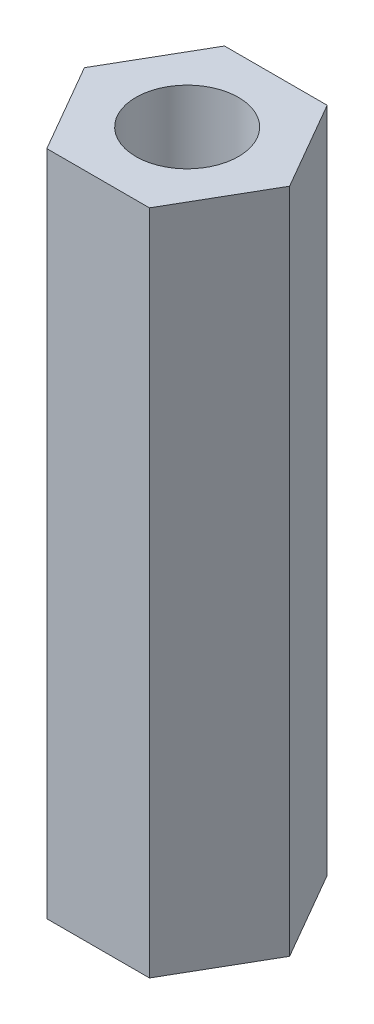
ISO-10303-21;
HEADER;
FILE_DESCRIPTION(('STEP AP214'),'2;1');
FILE_NAME('part.step','',(''),(''),'','','');
FILE_SCHEMA(('AUTOMOTIVE_DESIGN { 1 0 10303 214 1 1 1 1 }'));
ENDSEC;
DATA;
#1=APPLICATION_CONTEXT('core data for automotive mechanical design processes');
#2=APPLICATION_PROTOCOL_DEFINITION('international standard','automotive_design',2000,#1);
#3=PRODUCT_CONTEXT('',#1,'mechanical');
#4=PRODUCT('Part','Part','',(#3));
#5=PRODUCT_RELATED_PRODUCT_CATEGORY('part','',(#4));
#6=PRODUCT_DEFINITION_FORMATION('','',#4);
#7=PRODUCT_DEFINITION_CONTEXT('part definition',#1,'design');
#8=PRODUCT_DEFINITION('design','',#6,#7);
#9=PRODUCT_DEFINITION_SHAPE('','',#8);
#10=(LENGTH_UNIT() NAMED_UNIT(*) SI_UNIT(.MILLI.,.METRE.));
#11=(NAMED_UNIT(*) PLANE_ANGLE_UNIT() SI_UNIT($,.RADIAN.));
#12=(NAMED_UNIT(*) SI_UNIT($,.STERADIAN.) SOLID_ANGLE_UNIT());
#13=UNCERTAINTY_MEASURE_WITH_UNIT(LENGTH_MEASURE(1.E-05),#10,'distance_accuracy_value','');
#14=(GEOMETRIC_REPRESENTATION_CONTEXT(3) GLOBAL_UNCERTAINTY_ASSIGNED_CONTEXT((#13)) GLOBAL_UNIT_ASSIGNED_CONTEXT((#10,
#11,#12)) REPRESENTATION_CONTEXT('',''));
#15=CARTESIAN_POINT('',(0.,0.,0.));
#16=DIRECTION('',(0.,0.,1.));
#17=DIRECTION('',(1.,0.,0.));
#18=AXIS2_PLACEMENT_3D('',#15,#16,#17);
#19=CARTESIAN_POINT('',(0.,-15.,0.));
#20=DIRECTION('',(0.,1.,0.));
#21=DIRECTION('',(0.,0.,1.));
#22=AXIS2_PLACEMENT_3D('',#19,#20,#21);
#23=CYLINDRICAL_SURFACE('',#22,2.);
#24=CARTESIAN_POINT('',(0.,11.,0.));
#25=DIRECTION('',(0.,1.,0.));
#26=DIRECTION('',(0.,0.,1.));
#27=AXIS2_PLACEMENT_3D('',#24,#25,#26);
#28=CIRCLE('',#27,2.);
#29=CARTESIAN_POINT('',(0.,11.,2.));
#30=VERTEX_POINT('',#29);
#31=EDGE_CURVE('E197',#30,#30,#28,.T.);
#32=ORIENTED_EDGE('',*,*,#31,.T.);
#33=EDGE_LOOP('',(#32));
#34=FACE_BOUND('',#33,.T.);
#35=CARTESIAN_POINT('',(0.,-15.,0.));
#36=DIRECTION('',(0.,1.,0.));
#37=DIRECTION('',(0.,0.,1.));
#38=AXIS2_PLACEMENT_3D('',#35,#36,#37);
#39=CIRCLE('',#38,2.);
#40=CARTESIAN_POINT('',(2.,-15.,0.));
#41=VERTEX_POINT('',#40);
#42=CARTESIAN_POINT('',(-2.,-15.,0.));
#43=VERTEX_POINT('',#42);
#44=EDGE_CURVE('E50',#41,#43,#39,.F.);
#45=ORIENTED_EDGE('',*,*,#44,.T.);
#46=CARTESIAN_POINT('',(0.,-15.,0.));
#47=DIRECTION('',(0.,1.,0.));
#48=DIRECTION('',(0.,0.,1.));
#49=AXIS2_PLACEMENT_3D('',#46,#47,#48);
#50=CIRCLE('',#49,2.);
#51=EDGE_CURVE('E151',#43,#41,#50,.F.);
#52=ORIENTED_EDGE('',*,*,#51,.T.);
#53=EDGE_LOOP('',(#45,#52));
#54=FACE_BOUND('',#53,.T.);
#55=ADVANCED_FACE('F46',(#34,#54),#23,.F.);
#56=CARTESIAN_POINT('',(1.995272947503,-15.,3.466144344561));
#57=DIRECTION('',(0.866025403784429,0.,0.500000000000017));
#58=DIRECTION('',(0.500000000000017,0.,-0.866025403784429));
#59=AXIS2_PLACEMENT_3D('',#56,#57,#58);
#60=PLANE('',#59);
#61=DIRECTION('',(0.500000000000017,0.,-0.866025403784429));
#62=VECTOR('',#61,1.);
#63=CARTESIAN_POINT('',(3.99527294750324,11.,0.00204272942298056));
#64=LINE('',#63,#62);
#65=CARTESIAN_POINT('',(1.995272947503,11.,3.466144344561));
#66=VERTEX_POINT('',#65);
#67=CARTESIAN_POINT('',(3.99527294750324,11.,0.00204272942298056));
#68=VERTEX_POINT('',#67);
#69=EDGE_CURVE('E107',#66,#68,#64,.T.);
#70=ORIENTED_EDGE('',*,*,#69,.F.);
#71=DIRECTION('',(0.,1.,0.));
#72=VECTOR('',#71,1.);
#73=CARTESIAN_POINT('',(1.995272947503,0.,3.466144344561));
#74=LINE('',#73,#72);
#75=CARTESIAN_POINT('',(1.995272947503,-15.,3.466144344561));
#76=VERTEX_POINT('',#75);
#77=EDGE_CURVE('E11',#76,#66,#74,.T.);
#78=ORIENTED_EDGE('',*,*,#77,.F.);
#79=DIRECTION('',(0.500000000000017,0.,-0.866025403784429));
#80=VECTOR('',#79,1.);
#81=CARTESIAN_POINT('',(2.99527294750312,-15.,1.73409353699199));
#82=LINE('',#81,#80);
#83=CARTESIAN_POINT('',(3.99527294750324,-15.,0.00204272942298056));
#84=VERTEX_POINT('',#83);
#85=EDGE_CURVE('E130',#76,#84,#82,.T.);
#86=ORIENTED_EDGE('',*,*,#85,.T.);
#87=DIRECTION('',(0.,1.,0.));
#88=VECTOR('',#87,1.);
#89=CARTESIAN_POINT('',(3.99527294750324,0.,0.00204272942298056));
#90=LINE('',#89,#88);
#91=EDGE_CURVE('E56',#84,#68,#90,.T.);
#92=ORIENTED_EDGE('',*,*,#91,.T.);
#93=EDGE_LOOP('',(#70,#78,#86,#92));
#94=FACE_BOUND('',#93,.T.);
#95=ADVANCED_FACE('F117',(#94),#60,.T.);
#96=CARTESIAN_POINT('',(3.995272947503,-15.,0.002042729422841));
#97=DIRECTION('',(0.866025403784429,0.,-0.500000000000017));
#98=DIRECTION('',(-0.500000000000017,0.,-0.866025403784429));
#99=AXIS2_PLACEMENT_3D('',#96,#97,#98);
#100=PLANE('',#99);
#101=DIRECTION('',(-0.500000000000047,0.,-0.866025403784411));
#102=VECTOR('',#101,1.);
#103=CARTESIAN_POINT('',(1.99527294750289,11.,-3.46205888571494));
#104=LINE('',#103,#102);
#105=CARTESIAN_POINT('',(1.99527294750289,11.,-3.46205888571494));
#106=VERTEX_POINT('',#105);
#107=EDGE_CURVE('E121',#68,#106,#104,.T.);
#108=ORIENTED_EDGE('',*,*,#107,.F.);
#109=ORIENTED_EDGE('',*,*,#91,.F.);
#110=DIRECTION('',(-0.500000000000017,0.,-0.866025403784429));
#111=VECTOR('',#110,1.);
#112=CARTESIAN_POINT('',(2.99527294750295,-15.,-1.73000807814605));
#113=LINE('',#112,#111);
#114=CARTESIAN_POINT('',(1.99527294750289,-15.,-3.46205888571494));
#115=VERTEX_POINT('',#114);
#116=EDGE_CURVE('E137',#84,#115,#113,.T.);
#117=ORIENTED_EDGE('',*,*,#116,.T.);
#118=DIRECTION('',(0.,1.,0.));
#119=VECTOR('',#118,1.);
#120=CARTESIAN_POINT('',(1.99527294750289,0.,-3.46205888571494));
#121=LINE('',#120,#119);
#122=EDGE_CURVE('E167',#115,#106,#121,.T.);
#123=ORIENTED_EDGE('',*,*,#122,.T.);
#124=EDGE_LOOP('',(#108,#109,#117,#123));
#125=FACE_BOUND('',#124,.T.);
#126=ADVANCED_FACE('F192',(#125),#100,.T.);
#127=CARTESIAN_POINT('',(1.995272947503,-15.,-3.462058885715));
#128=DIRECTION('',(0.,0.,-1.));
#129=DIRECTION('',(-1.,0.,0.));
#130=AXIS2_PLACEMENT_3D('',#127,#128,#129);
#131=PLANE('',#130);
#132=DIRECTION('',(-1.,0.,0.));
#133=VECTOR('',#132,1.);
#134=CARTESIAN_POINT('',(-2.004727052497,11.,-3.462058885715));
#135=LINE('',#134,#133);
#136=CARTESIAN_POINT('',(-2.004727052497,11.,-3.462058885715));
#137=VERTEX_POINT('',#136);
#138=EDGE_CURVE('E158',#106,#137,#135,.T.);
#139=ORIENTED_EDGE('',*,*,#138,.F.);
#140=ORIENTED_EDGE('',*,*,#122,.F.);
#141=DIRECTION('',(-1.,0.,0.));
#142=VECTOR('',#141,1.);
#143=CARTESIAN_POINT('',(-0.0047270524970004,-15.,-3.462058885715));
#144=LINE('',#143,#142);
#145=CARTESIAN_POINT('',(-2.004727052497,-15.,-3.462058885715));
#146=VERTEX_POINT('',#145);
#147=EDGE_CURVE('E143',#115,#146,#144,.T.);
#148=ORIENTED_EDGE('',*,*,#147,.T.);
#149=DIRECTION('',(0.,1.,0.));
#150=VECTOR('',#149,1.);
#151=CARTESIAN_POINT('',(-2.004727052497,0.,-3.462058885715));
#152=LINE('',#151,#150);
#153=EDGE_CURVE('E171',#146,#137,#152,.T.);
#154=ORIENTED_EDGE('',*,*,#153,.T.);
#155=EDGE_LOOP('',(#139,#140,#148,#154));
#156=FACE_BOUND('',#155,.T.);
#157=ADVANCED_FACE('F190',(#156),#131,.T.);
#158=CARTESIAN_POINT('',(-2.004727052497,-15.,-3.462058885715));
#159=DIRECTION('',(-0.866025403784429,0.,-0.500000000000017));
#160=DIRECTION('',(-0.500000000000017,0.,0.866025403784429));
#161=AXIS2_PLACEMENT_3D('',#158,#159,#160);
#162=PLANE('',#161);
#163=DIRECTION('',(-0.500000000000017,0.,0.866025403784429));
#164=VECTOR('',#163,1.);
#165=CARTESIAN_POINT('',(-4.00472705249711,11.,0.00204272942277983));
#166=LINE('',#165,#164);
#167=CARTESIAN_POINT('',(-4.00472705249711,11.,0.00204272942277983));
#168=VERTEX_POINT('',#167);
#169=EDGE_CURVE('E155',#137,#168,#166,.T.);
#170=ORIENTED_EDGE('',*,*,#169,.F.);
#171=ORIENTED_EDGE('',*,*,#153,.F.);
#172=DIRECTION('',(-0.500000000000017,0.,0.866025403784429));
#173=VECTOR('',#172,1.);
#174=CARTESIAN_POINT('',(-3.00472705249705,-15.,-1.73000807814611));
#175=LINE('',#174,#173);
#176=CARTESIAN_POINT('',(-4.00472705249711,-15.,0.00204272942277983));
#177=VERTEX_POINT('',#176);
#178=EDGE_CURVE('E146',#146,#177,#175,.T.);
#179=ORIENTED_EDGE('',*,*,#178,.T.);
#180=DIRECTION('',(0.,1.,0.));
#181=VECTOR('',#180,1.);
#182=CARTESIAN_POINT('',(-4.00472705249711,0.,0.00204272942277983));
#183=LINE('',#182,#181);
#184=EDGE_CURVE('E135',#177,#168,#183,.T.);
#185=ORIENTED_EDGE('',*,*,#184,.T.);
#186=EDGE_LOOP('',(#170,#171,#179,#185));
#187=FACE_BOUND('',#186,.T.);
#188=ADVANCED_FACE('F179',(#187),#162,.T.);
#189=CARTESIAN_POINT('',(-4.004727052497,-15.,0.00204272942284));
#190=DIRECTION('',(-0.866025403784429,0.,0.500000000000017));
#191=DIRECTION('',(0.500000000000017,0.,0.866025403784429));
#192=AXIS2_PLACEMENT_3D('',#189,#190,#191);
#193=PLANE('',#192);
#194=DIRECTION('',(0.50000000000003,0.,0.866025403784421));
#195=VECTOR('',#194,1.);
#196=CARTESIAN_POINT('',(-2.00472705249676,11.,3.46614434456086));
#197=LINE('',#196,#195);
#198=CARTESIAN_POINT('',(-2.00472705249676,11.,3.46614434456086));
#199=VERTEX_POINT('',#198);
#200=EDGE_CURVE('E64',#168,#199,#197,.T.);
#201=ORIENTED_EDGE('',*,*,#200,.F.);
#202=ORIENTED_EDGE('',*,*,#184,.F.);
#203=DIRECTION('',(0.500000000000017,0.,0.866025403784429));
#204=VECTOR('',#203,1.);
#205=CARTESIAN_POINT('',(-3.00472705249688,-15.,1.73409353699185));
#206=LINE('',#205,#204);
#207=CARTESIAN_POINT('',(-2.00472705249676,-15.,3.46614434456086));
#208=VERTEX_POINT('',#207);
#209=EDGE_CURVE('E149',#177,#208,#206,.T.);
#210=ORIENTED_EDGE('',*,*,#209,.T.);
#211=DIRECTION('',(0.,1.,0.));
#212=VECTOR('',#211,1.);
#213=CARTESIAN_POINT('',(-2.00472705249676,0.,3.46614434456086));
#214=LINE('',#213,#212);
#215=EDGE_CURVE('E126',#208,#199,#214,.T.);
#216=ORIENTED_EDGE('',*,*,#215,.T.);
#217=EDGE_LOOP('',(#201,#202,#210,#216));
#218=FACE_BOUND('',#217,.T.);
#219=ADVANCED_FACE('F183',(#218),#193,.T.);
#220=CARTESIAN_POINT('',(-2.004727052497,-15.,3.466144344561));
#221=DIRECTION('',(0.,0.,1.));
#222=DIRECTION('',(1.,0.,0.));
#223=AXIS2_PLACEMENT_3D('',#220,#221,#222);
#224=PLANE('',#223);
#225=DIRECTION('',(1.,0.,0.));
#226=VECTOR('',#225,1.);
#227=CARTESIAN_POINT('',(1.995272947503,11.,3.466144344561));
#228=LINE('',#227,#226);
#229=EDGE_CURVE('E104',#199,#66,#228,.T.);
#230=ORIENTED_EDGE('',*,*,#229,.F.);
#231=ORIENTED_EDGE('',*,*,#215,.F.);
#232=DIRECTION('',(1.,0.,0.));
#233=VECTOR('',#232,1.);
#234=CARTESIAN_POINT('',(-0.00472705249700018,-15.,3.466144344561));
#235=LINE('',#234,#233);
#236=EDGE_CURVE('E125',#208,#76,#235,.T.);
#237=ORIENTED_EDGE('',*,*,#236,.T.);
#238=ORIENTED_EDGE('',*,*,#77,.T.);
#239=EDGE_LOOP('',(#230,#231,#237,#238));
#240=FACE_BOUND('',#239,.T.);
#241=ADVANCED_FACE('F123',(#240),#224,.T.);
#242=CARTESIAN_POINT('',(0.,-15.,0.));
#243=DIRECTION('',(0.,1.,0.));
#244=DIRECTION('',(0.,0.,1.));
#245=AXIS2_PLACEMENT_3D('',#242,#243,#244);
#246=PLANE('',#245);
#247=ORIENTED_EDGE('',*,*,#236,.F.);
#248=ORIENTED_EDGE('',*,*,#209,.F.);
#249=ORIENTED_EDGE('',*,*,#178,.F.);
#250=ORIENTED_EDGE('',*,*,#147,.F.);
#251=ORIENTED_EDGE('',*,*,#116,.F.);
#252=ORIENTED_EDGE('',*,*,#85,.F.);
#253=EDGE_LOOP('',(#247,#248,#249,#250,#251,#252));
#254=FACE_BOUND('',#253,.T.);
#255=ORIENTED_EDGE('',*,*,#51,.F.);
#256=ORIENTED_EDGE('',*,*,#44,.F.);
#257=EDGE_LOOP('',(#255,#256));
#258=FACE_BOUND('',#257,.T.);
#259=ADVANCED_FACE('F48',(#254,#258),#246,.F.);
#260=CARTESIAN_POINT('',(0.,11.,0.));
#261=DIRECTION('',(0.,-1.,0.));
#262=DIRECTION('',(0.,0.,-1.));
#263=AXIS2_PLACEMENT_3D('',#260,#261,#262);
#264=PLANE('',#263);
#265=ORIENTED_EDGE('',*,*,#31,.F.);
#266=EDGE_LOOP('',(#265));
#267=FACE_BOUND('',#266,.T.);
#268=ORIENTED_EDGE('',*,*,#200,.T.);
#269=ORIENTED_EDGE('',*,*,#229,.T.);
#270=ORIENTED_EDGE('',*,*,#69,.T.);
#271=ORIENTED_EDGE('',*,*,#107,.T.);
#272=ORIENTED_EDGE('',*,*,#138,.T.);
#273=ORIENTED_EDGE('',*,*,#169,.T.);
#274=EDGE_LOOP('',(#268,#269,#270,#271,#272,#273));
#275=FACE_BOUND('',#274,.T.);
#276=ADVANCED_FACE('F106',(#267,#275),#264,.F.);
#277=CLOSED_SHELL('',(#55,#95,#126,#157,#188,#219,#241,#259,#276));
#278=MANIFOLD_SOLID_BREP('B2',#277);
#279=ADVANCED_BREP_SHAPE_REPRESENTATION('',(#18,#278),#14);
#280=SHAPE_DEFINITION_REPRESENTATION(#9,#279);
ENDSEC;
END-ISO-10303-21;
